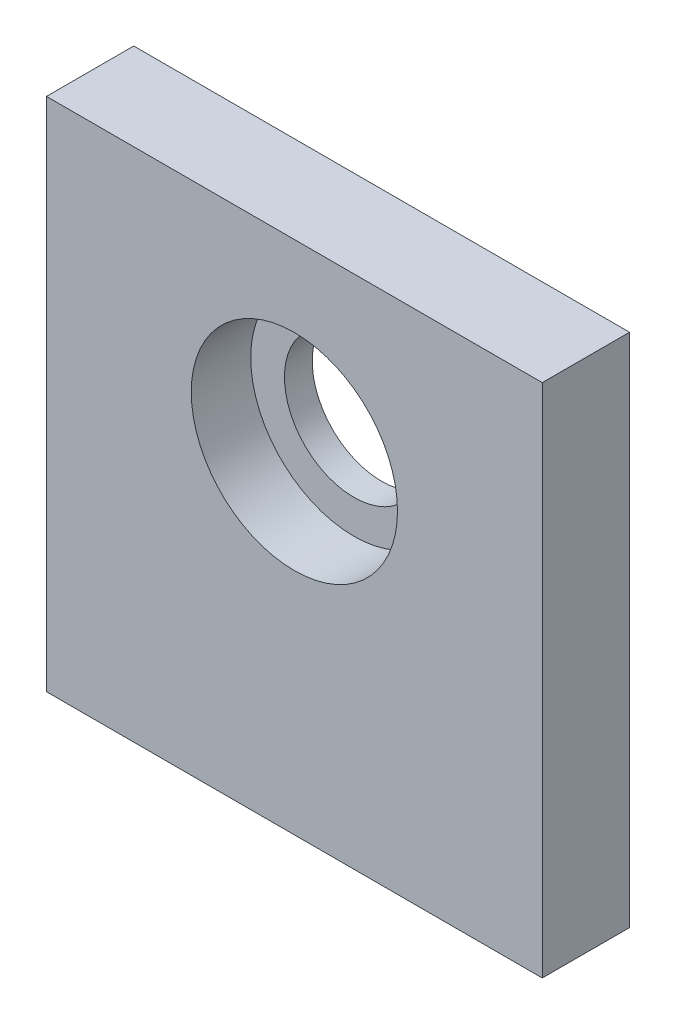
ISO-10303-21;
HEADER;
FILE_DESCRIPTION(('STEP AP214'),'2;1');
FILE_NAME('part.step','',(''),(''),'','','');
FILE_SCHEMA(('AUTOMOTIVE_DESIGN { 1 0 10303 214 1 1 1 1 }'));
ENDSEC;
DATA;
#1=APPLICATION_CONTEXT('core data for automotive mechanical design processes');
#2=APPLICATION_PROTOCOL_DEFINITION('international standard','automotive_design',2000,#1);
#3=PRODUCT_CONTEXT('',#1,'mechanical');
#4=PRODUCT('Part','Part','',(#3));
#5=PRODUCT_RELATED_PRODUCT_CATEGORY('part','',(#4));
#6=PRODUCT_DEFINITION_FORMATION('','',#4);
#7=PRODUCT_DEFINITION_CONTEXT('part definition',#1,'design');
#8=PRODUCT_DEFINITION('design','',#6,#7);
#9=PRODUCT_DEFINITION_SHAPE('','',#8);
#10=(LENGTH_UNIT() NAMED_UNIT(*) SI_UNIT(.MILLI.,.METRE.));
#11=(NAMED_UNIT(*) PLANE_ANGLE_UNIT() SI_UNIT($,.RADIAN.));
#12=(NAMED_UNIT(*) SI_UNIT($,.STERADIAN.) SOLID_ANGLE_UNIT());
#13=UNCERTAINTY_MEASURE_WITH_UNIT(LENGTH_MEASURE(1.E-05),#10,'distance_accuracy_value','');
#14=(GEOMETRIC_REPRESENTATION_CONTEXT(3) GLOBAL_UNCERTAINTY_ASSIGNED_CONTEXT((#13)) GLOBAL_UNIT_ASSIGNED_CONTEXT((#10,
#11,#12)) REPRESENTATION_CONTEXT('',''));
#15=CARTESIAN_POINT('',(0.,0.,0.));
#16=DIRECTION('',(0.,0.,1.));
#17=DIRECTION('',(1.,0.,0.));
#18=AXIS2_PLACEMENT_3D('',#15,#16,#17);
#19=CARTESIAN_POINT('',(-62.5,0.,-22.));
#20=DIRECTION('',(0.,0.,1.));
#21=DIRECTION('',(1.,0.,0.));
#22=AXIS2_PLACEMENT_3D('',#19,#20,#21);
#23=PLANE('',#22);
#24=DIRECTION('',(0.,-1.,0.));
#25=VECTOR('',#24,1.);
#26=CARTESIAN_POINT('',(-62.5,130.,-22.));
#27=LINE('',#26,#25);
#28=CARTESIAN_POINT('',(-62.5,130.,-22.));
#29=VERTEX_POINT('',#28);
#30=CARTESIAN_POINT('',(-62.5,0.,-22.));
#31=VERTEX_POINT('',#30);
#32=EDGE_CURVE('E123',#29,#31,#27,.T.);
#33=ORIENTED_EDGE('',*,*,#32,.F.);
#34=DIRECTION('',(-1.,0.,0.));
#35=VECTOR('',#34,1.);
#36=CARTESIAN_POINT('',(-62.5,130.,-22.));
#37=LINE('',#36,#35);
#38=CARTESIAN_POINT('',(62.5,130.,-22.));
#39=VERTEX_POINT('',#38);
#40=EDGE_CURVE('E130',#39,#29,#37,.T.);
#41=ORIENTED_EDGE('',*,*,#40,.F.);
#42=DIRECTION('',(0.,1.,0.));
#43=VECTOR('',#42,1.);
#44=CARTESIAN_POINT('',(62.5,130.,-22.));
#45=LINE('',#44,#43);
#46=CARTESIAN_POINT('',(62.5,0.,-22.));
#47=VERTEX_POINT('',#46);
#48=EDGE_CURVE('E128',#47,#39,#45,.T.);
#49=ORIENTED_EDGE('',*,*,#48,.F.);
#50=DIRECTION('',(1.,0.,0.));
#51=VECTOR('',#50,1.);
#52=CARTESIAN_POINT('',(-62.5,0.,-22.));
#53=LINE('',#52,#51);
#54=EDGE_CURVE('E125',#31,#47,#53,.T.);
#55=ORIENTED_EDGE('',*,*,#54,.F.);
#56=EDGE_LOOP('',(#33,#41,#49,#55));
#57=FACE_BOUND('',#56,.T.);
#58=CARTESIAN_POINT('',(0.,83.7,-22.));
#59=DIRECTION('',(0.,0.,1.));
#60=DIRECTION('',(1.,0.,0.));
#61=AXIS2_PLACEMENT_3D('',#58,#59,#60);
#62=CIRCLE('',#61,17.5);
#63=CARTESIAN_POINT('',(17.5,83.7,-22.));
#64=VERTEX_POINT('',#63);
#65=EDGE_CURVE('E119',#64,#64,#62,.T.);
#66=ORIENTED_EDGE('',*,*,#65,.T.);
#67=EDGE_LOOP('',(#66));
#68=FACE_BOUND('',#67,.T.);
#69=ADVANCED_FACE('F36',(#57,#68),#23,.F.);
#70=CARTESIAN_POINT('',(-62.5,0.,0.));
#71=DIRECTION('',(0.,0.,1.));
#72=DIRECTION('',(1.,0.,0.));
#73=AXIS2_PLACEMENT_3D('',#70,#71,#72);
#74=PLANE('',#73);
#75=DIRECTION('',(0.,-1.,0.));
#76=VECTOR('',#75,1.);
#77=CARTESIAN_POINT('',(-62.5,130.,0.));
#78=LINE('',#77,#76);
#79=CARTESIAN_POINT('',(-62.5,130.,0.));
#80=VERTEX_POINT('',#79);
#81=CARTESIAN_POINT('',(-62.5,0.,0.));
#82=VERTEX_POINT('',#81);
#83=EDGE_CURVE('E122',#80,#82,#78,.T.);
#84=ORIENTED_EDGE('',*,*,#83,.T.);
#85=DIRECTION('',(1.,0.,0.));
#86=VECTOR('',#85,1.);
#87=CARTESIAN_POINT('',(-62.5,0.,0.));
#88=LINE('',#87,#86);
#89=CARTESIAN_POINT('',(62.5,0.,0.));
#90=VERTEX_POINT('',#89);
#91=EDGE_CURVE('E134',#82,#90,#88,.T.);
#92=ORIENTED_EDGE('',*,*,#91,.T.);
#93=DIRECTION('',(0.,1.,0.));
#94=VECTOR('',#93,1.);
#95=CARTESIAN_POINT('',(62.5,130.,0.));
#96=LINE('',#95,#94);
#97=CARTESIAN_POINT('',(62.5,130.,0.));
#98=VERTEX_POINT('',#97);
#99=EDGE_CURVE('E137',#90,#98,#96,.T.);
#100=ORIENTED_EDGE('',*,*,#99,.T.);
#101=DIRECTION('',(-1.,0.,0.));
#102=VECTOR('',#101,1.);
#103=CARTESIAN_POINT('',(-62.5,130.,0.));
#104=LINE('',#103,#102);
#105=EDGE_CURVE('E126',#98,#80,#104,.T.);
#106=ORIENTED_EDGE('',*,*,#105,.T.);
#107=EDGE_LOOP('',(#84,#92,#100,#106));
#108=FACE_BOUND('',#107,.T.);
#109=CARTESIAN_POINT('',(0.,83.7,0.));
#110=DIRECTION('',(0.,0.,1.));
#111=DIRECTION('',(1.,0.,0.));
#112=AXIS2_PLACEMENT_3D('',#109,#110,#111);
#113=CIRCLE('',#112,26.);
#114=CARTESIAN_POINT('',(26.,83.7,0.));
#115=VERTEX_POINT('',#114);
#116=EDGE_CURVE('E110',#115,#115,#113,.T.);
#117=ORIENTED_EDGE('',*,*,#116,.F.);
#118=EDGE_LOOP('',(#117));
#119=FACE_BOUND('',#118,.T.);
#120=ADVANCED_FACE('F144',(#108,#119),#74,.T.);
#121=CARTESIAN_POINT('',(-62.5,130.,-22.));
#122=DIRECTION('',(-1.,0.,0.));
#123=DIRECTION('',(0.,-1.,0.));
#124=AXIS2_PLACEMENT_3D('',#121,#122,#123);
#125=PLANE('',#124);
#126=ORIENTED_EDGE('',*,*,#83,.F.);
#127=DIRECTION('',(0.,0.,1.));
#128=VECTOR('',#127,1.);
#129=CARTESIAN_POINT('',(-62.5,130.,-22.));
#130=LINE('',#129,#128);
#131=EDGE_CURVE('E11',#29,#80,#130,.T.);
#132=ORIENTED_EDGE('',*,*,#131,.F.);
#133=ORIENTED_EDGE('',*,*,#32,.T.);
#134=DIRECTION('',(0.,0.,1.));
#135=VECTOR('',#134,1.);
#136=CARTESIAN_POINT('',(-62.5,0.,-22.));
#137=LINE('',#136,#135);
#138=EDGE_CURVE('E40',#31,#82,#137,.T.);
#139=ORIENTED_EDGE('',*,*,#138,.T.);
#140=EDGE_LOOP('',(#126,#132,#133,#139));
#141=FACE_BOUND('',#140,.T.);
#142=ADVANCED_FACE('F38',(#141),#125,.T.);
#143=CARTESIAN_POINT('',(-62.5,130.,-22.));
#144=DIRECTION('',(0.,1.,0.));
#145=DIRECTION('',(0.,0.,1.));
#146=AXIS2_PLACEMENT_3D('',#143,#144,#145);
#147=PLANE('',#146);
#148=ORIENTED_EDGE('',*,*,#105,.F.);
#149=DIRECTION('',(0.,0.,1.));
#150=VECTOR('',#149,1.);
#151=CARTESIAN_POINT('',(62.5,130.,-22.));
#152=LINE('',#151,#150);
#153=EDGE_CURVE('E46',#39,#98,#152,.T.);
#154=ORIENTED_EDGE('',*,*,#153,.F.);
#155=ORIENTED_EDGE('',*,*,#40,.T.);
#156=ORIENTED_EDGE('',*,*,#131,.T.);
#157=EDGE_LOOP('',(#148,#154,#155,#156));
#158=FACE_BOUND('',#157,.T.);
#159=ADVANCED_FACE('F146',(#158),#147,.T.);
#160=CARTESIAN_POINT('',(62.5,130.,-22.));
#161=DIRECTION('',(1.,0.,0.));
#162=DIRECTION('',(0.,1.,0.));
#163=AXIS2_PLACEMENT_3D('',#160,#161,#162);
#164=PLANE('',#163);
#165=ORIENTED_EDGE('',*,*,#99,.F.);
#166=DIRECTION('',(0.,0.,1.));
#167=VECTOR('',#166,1.);
#168=CARTESIAN_POINT('',(62.5,0.,-22.));
#169=LINE('',#168,#167);
#170=EDGE_CURVE('E141',#47,#90,#169,.T.);
#171=ORIENTED_EDGE('',*,*,#170,.F.);
#172=ORIENTED_EDGE('',*,*,#48,.T.);
#173=ORIENTED_EDGE('',*,*,#153,.T.);
#174=EDGE_LOOP('',(#165,#171,#172,#173));
#175=FACE_BOUND('',#174,.T.);
#176=ADVANCED_FACE('F149',(#175),#164,.T.);
#177=CARTESIAN_POINT('',(-62.5,0.,-22.));
#178=DIRECTION('',(0.,-1.,0.));
#179=DIRECTION('',(0.,0.,-1.));
#180=AXIS2_PLACEMENT_3D('',#177,#178,#179);
#181=PLANE('',#180);
#182=CARTESIAN_POINT('',(-50.,0.,-11.));
#183=DIRECTION('',(0.,-1.,0.));
#184=DIRECTION('',(0.,0.,-1.));
#185=AXIS2_PLACEMENT_3D('',#182,#183,#184);
#186=CIRCLE('',#185,2.09999999999999);
#187=CARTESIAN_POINT('',(-50.,0.,-13.1));
#188=VERTEX_POINT('',#187);
#189=EDGE_CURVE('E100',#188,#188,#186,.T.);
#190=ORIENTED_EDGE('',*,*,#189,.F.);
#191=EDGE_LOOP('',(#190));
#192=FACE_BOUND('',#191,.T.);
#193=CARTESIAN_POINT('',(50.,0.,-11.));
#194=DIRECTION('',(0.,-1.,0.));
#195=DIRECTION('',(0.,0.,-1.));
#196=AXIS2_PLACEMENT_3D('',#193,#194,#195);
#197=CIRCLE('',#196,2.09999999999999);
#198=CARTESIAN_POINT('',(50.,0.,-13.1));
#199=VERTEX_POINT('',#198);
#200=EDGE_CURVE('E99',#199,#199,#197,.T.);
#201=ORIENTED_EDGE('',*,*,#200,.F.);
#202=EDGE_LOOP('',(#201));
#203=FACE_BOUND('',#202,.T.);
#204=ORIENTED_EDGE('',*,*,#91,.F.);
#205=ORIENTED_EDGE('',*,*,#138,.F.);
#206=ORIENTED_EDGE('',*,*,#54,.T.);
#207=ORIENTED_EDGE('',*,*,#170,.T.);
#208=EDGE_LOOP('',(#204,#205,#206,#207));
#209=FACE_BOUND('',#208,.T.);
#210=ADVANCED_FACE('F142',(#192,#203,#209),#181,.T.);
#211=CARTESIAN_POINT('',(0.,83.7,6.08806623640745));
#212=DIRECTION('',(0.,0.,1.));
#213=DIRECTION('',(1.,0.,0.));
#214=AXIS2_PLACEMENT_3D('',#211,#212,#213);
#215=CYLINDRICAL_SURFACE('',#214,17.5);
#216=CARTESIAN_POINT('',(0.,83.7,-15.));
#217=DIRECTION('',(0.,0.,1.));
#218=DIRECTION('',(1.,0.,0.));
#219=AXIS2_PLACEMENT_3D('',#216,#217,#218);
#220=CIRCLE('',#219,17.5);
#221=CARTESIAN_POINT('',(17.5,83.7,-15.));
#222=VERTEX_POINT('',#221);
#223=EDGE_CURVE('E116',#222,#222,#220,.T.);
#224=ORIENTED_EDGE('',*,*,#223,.T.);
#225=EDGE_LOOP('',(#224));
#226=FACE_BOUND('',#225,.T.);
#227=ORIENTED_EDGE('',*,*,#65,.F.);
#228=EDGE_LOOP('',(#227));
#229=FACE_BOUND('',#228,.T.);
#230=ADVANCED_FACE('F156',(#226,#229),#215,.F.);
#231=CARTESIAN_POINT('',(0.,109.7,-15.));
#232=DIRECTION('',(0.,0.,1.));
#233=DIRECTION('',(1.,0.,0.));
#234=AXIS2_PLACEMENT_3D('',#231,#232,#233);
#235=PLANE('',#234);
#236=CARTESIAN_POINT('',(0.,83.7,-15.));
#237=DIRECTION('',(0.,0.,1.));
#238=DIRECTION('',(1.,0.,0.));
#239=AXIS2_PLACEMENT_3D('',#236,#237,#238);
#240=CIRCLE('',#239,26.);
#241=CARTESIAN_POINT('',(26.,83.7,-15.));
#242=VERTEX_POINT('',#241);
#243=EDGE_CURVE('E113',#242,#242,#240,.T.);
#244=ORIENTED_EDGE('',*,*,#243,.T.);
#245=EDGE_LOOP('',(#244));
#246=FACE_BOUND('',#245,.T.);
#247=ORIENTED_EDGE('',*,*,#223,.F.);
#248=EDGE_LOOP('',(#247));
#249=FACE_BOUND('',#248,.T.);
#250=ADVANCED_FACE('F158',(#246,#249),#235,.T.);
#251=CARTESIAN_POINT('',(0.,83.7,6.08806623640745));
#252=DIRECTION('',(0.,0.,1.));
#253=DIRECTION('',(1.,0.,0.));
#254=AXIS2_PLACEMENT_3D('',#251,#252,#253);
#255=CYLINDRICAL_SURFACE('',#254,26.);
#256=ORIENTED_EDGE('',*,*,#116,.T.);
#257=EDGE_LOOP('',(#256));
#258=FACE_BOUND('',#257,.T.);
#259=ORIENTED_EDGE('',*,*,#243,.F.);
#260=EDGE_LOOP('',(#259));
#261=FACE_BOUND('',#260,.T.);
#262=ADVANCED_FACE('F165',(#258,#261),#255,.F.);
#263=CARTESIAN_POINT('',(50.,14.,-11.));
#264=DIRECTION('',(0.,-1.,0.));
#265=DIRECTION('',(0.,0.,-1.));
#266=AXIS2_PLACEMENT_3D('',#263,#264,#265);
#267=CONICAL_SURFACE('',#266,2.09999999999999,1.02974425867665);
#268=CARTESIAN_POINT('',(50.,15.2618072999579,-11.));
#269=VERTEX_POINT('',#268);
#270=VERTEX_LOOP('',#269);
#271=FACE_BOUND('',#270,.T.);
#272=CARTESIAN_POINT('',(50.,14.,-11.));
#273=DIRECTION('',(0.,-1.,0.));
#274=DIRECTION('',(0.,0.,-1.));
#275=AXIS2_PLACEMENT_3D('',#272,#273,#274);
#276=CIRCLE('',#275,2.09999999999999);
#277=CARTESIAN_POINT('',(50.,14.,-13.1));
#278=VERTEX_POINT('',#277);
#279=EDGE_CURVE('E103',#278,#278,#276,.T.);
#280=ORIENTED_EDGE('',*,*,#279,.T.);
#281=EDGE_LOOP('',(#280));
#282=FACE_BOUND('',#281,.T.);
#283=ADVANCED_FACE('F197',(#271,#282),#267,.F.);
#284=CARTESIAN_POINT('',(50.,0.,-11.));
#285=DIRECTION('',(0.,-1.,0.));
#286=DIRECTION('',(0.,0.,-1.));
#287=AXIS2_PLACEMENT_3D('',#284,#285,#286);
#288=CYLINDRICAL_SURFACE('',#287,2.09999999999999);
#289=ORIENTED_EDGE('',*,*,#279,.F.);
#290=EDGE_LOOP('',(#289));
#291=FACE_BOUND('',#290,.T.);
#292=ORIENTED_EDGE('',*,*,#200,.T.);
#293=EDGE_LOOP('',(#292));
#294=FACE_BOUND('',#293,.T.);
#295=ADVANCED_FACE('F93',(#291,#294),#288,.F.);
#296=CARTESIAN_POINT('',(-50.,14.,-11.));
#297=DIRECTION('',(0.,-1.,0.));
#298=DIRECTION('',(0.,0.,-1.));
#299=AXIS2_PLACEMENT_3D('',#296,#297,#298);
#300=CONICAL_SURFACE('',#299,2.09999999999999,1.02974425867665);
#301=CARTESIAN_POINT('',(-50.,15.2618072999579,-11.));
#302=VERTEX_POINT('',#301);
#303=VERTEX_LOOP('',#302);
#304=FACE_BOUND('',#303,.T.);
#305=CARTESIAN_POINT('',(-50.,14.,-11.));
#306=DIRECTION('',(0.,-1.,0.));
#307=DIRECTION('',(0.,0.,-1.));
#308=AXIS2_PLACEMENT_3D('',#305,#306,#307);
#309=CIRCLE('',#308,2.09999999999999);
#310=CARTESIAN_POINT('',(-50.,14.,-13.1));
#311=VERTEX_POINT('',#310);
#312=EDGE_CURVE('E97',#311,#311,#309,.T.);
#313=ORIENTED_EDGE('',*,*,#312,.T.);
#314=EDGE_LOOP('',(#313));
#315=FACE_BOUND('',#314,.T.);
#316=ADVANCED_FACE('F89',(#304,#315),#300,.F.);
#317=CARTESIAN_POINT('',(-50.,0.,-11.));
#318=DIRECTION('',(0.,-1.,0.));
#319=DIRECTION('',(0.,0.,-1.));
#320=AXIS2_PLACEMENT_3D('',#317,#318,#319);
#321=CYLINDRICAL_SURFACE('',#320,2.09999999999999);
#322=ORIENTED_EDGE('',*,*,#312,.F.);
#323=EDGE_LOOP('',(#322));
#324=FACE_BOUND('',#323,.T.);
#325=ORIENTED_EDGE('',*,*,#189,.T.);
#326=EDGE_LOOP('',(#325));
#327=FACE_BOUND('',#326,.T.);
#328=ADVANCED_FACE('F92',(#324,#327),#321,.F.);
#329=CLOSED_SHELL('',(#69,#120,#142,#159,#176,#210,#230,#250,#262,#283,#295,#316,#328));
#330=MANIFOLD_SOLID_BREP('B2',#329);
#331=ADVANCED_BREP_SHAPE_REPRESENTATION('',(#18,#330),#14);
#332=SHAPE_DEFINITION_REPRESENTATION(#9,#331);
ENDSEC;
END-ISO-10303-21;
